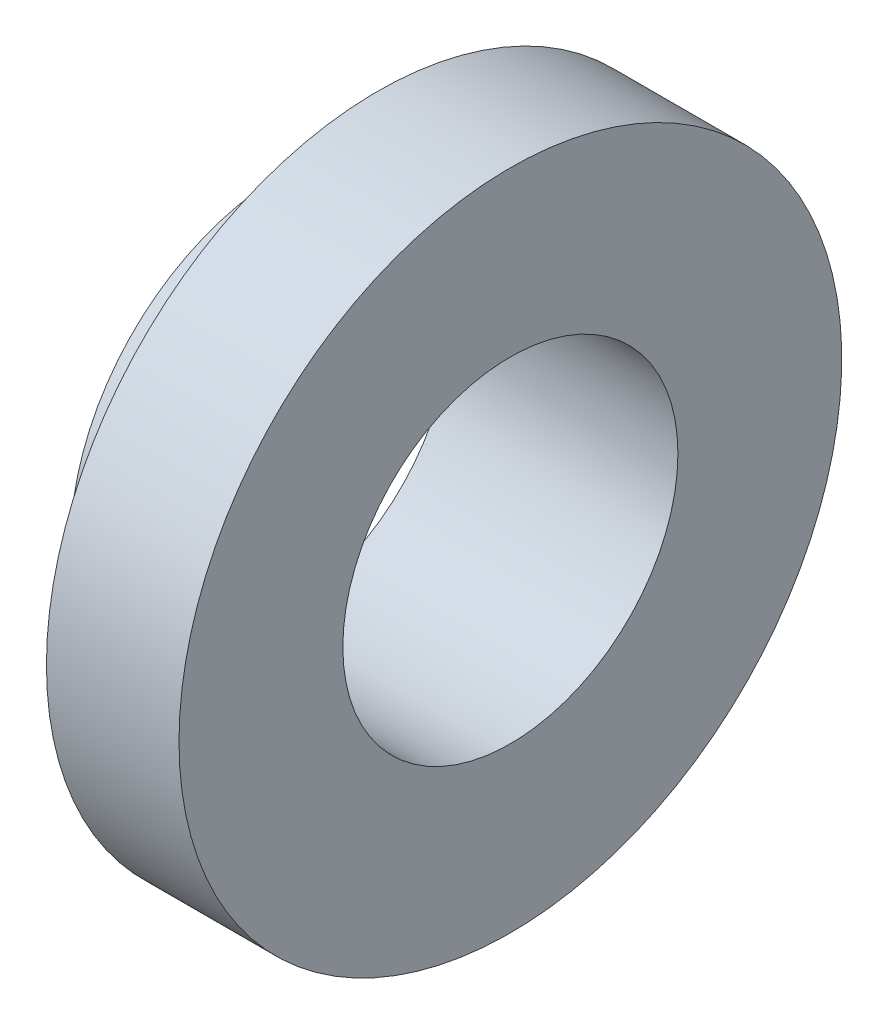
ISO-10303-21;
HEADER;
FILE_DESCRIPTION(('STEP AP214'),'2;1');
FILE_NAME('part.step','',(''),(''),'','','');
FILE_SCHEMA(('AUTOMOTIVE_DESIGN { 1 0 10303 214 1 1 1 1 }'));
ENDSEC;
DATA;
#1=APPLICATION_CONTEXT('core data for automotive mechanical design processes');
#2=APPLICATION_PROTOCOL_DEFINITION('international standard','automotive_design',2000,#1);
#3=PRODUCT_CONTEXT('',#1,'mechanical');
#4=PRODUCT('Part','Part','',(#3));
#5=PRODUCT_RELATED_PRODUCT_CATEGORY('part','',(#4));
#6=PRODUCT_DEFINITION_FORMATION('','',#4);
#7=PRODUCT_DEFINITION_CONTEXT('part definition',#1,'design');
#8=PRODUCT_DEFINITION('design','',#6,#7);
#9=PRODUCT_DEFINITION_SHAPE('','',#8);
#10=(LENGTH_UNIT() NAMED_UNIT(*) SI_UNIT(.MILLI.,.METRE.));
#11=(NAMED_UNIT(*) PLANE_ANGLE_UNIT() SI_UNIT($,.RADIAN.));
#12=(NAMED_UNIT(*) SI_UNIT($,.STERADIAN.) SOLID_ANGLE_UNIT());
#13=UNCERTAINTY_MEASURE_WITH_UNIT(LENGTH_MEASURE(1.E-05),#10,'distance_accuracy_value','');
#14=(GEOMETRIC_REPRESENTATION_CONTEXT(3) GLOBAL_UNCERTAINTY_ASSIGNED_CONTEXT((#13)) GLOBAL_UNIT_ASSIGNED_CONTEXT((#10,
#11,#12)) REPRESENTATION_CONTEXT('',''));
#15=CARTESIAN_POINT('',(0.,0.,0.));
#16=DIRECTION('',(0.,0.,1.));
#17=DIRECTION('',(1.,0.,0.));
#18=AXIS2_PLACEMENT_3D('',#15,#16,#17);
#19=CARTESIAN_POINT('',(5.45020000002849,4.0132,0.));
#20=DIRECTION('',(-1.,0.,0.));
#21=DIRECTION('',(0.,0.,1.));
#22=AXIS2_PLACEMENT_3D('',#19,#20,#21);
#23=PLANE('',#22);
#24=CARTESIAN_POINT('',(5.45020000002849,0.,0.));
#25=DIRECTION('',(-1.,0.,0.));
#26=DIRECTION('',(0.,0.,1.));
#27=AXIS2_PLACEMENT_3D('',#24,#25,#26);
#28=CIRCLE('',#27,7.9375);
#29=CARTESIAN_POINT('',(5.45020000002849,0.,7.9375));
#30=VERTEX_POINT('',#29);
#31=EDGE_CURVE('E62',#30,#30,#28,.T.);
#32=ORIENTED_EDGE('',*,*,#31,.F.);
#33=EDGE_LOOP('',(#32));
#34=FACE_BOUND('',#33,.T.);
#35=CARTESIAN_POINT('',(5.45020000002849,0.,0.));
#36=DIRECTION('',(-1.,0.,0.));
#37=DIRECTION('',(0.,0.,1.));
#38=AXIS2_PLACEMENT_3D('',#35,#36,#37);
#39=CIRCLE('',#38,4.0132);
#40=CARTESIAN_POINT('',(5.45020000002849,0.,4.0132));
#41=VERTEX_POINT('',#40);
#42=EDGE_CURVE('E10',#41,#41,#39,.T.);
#43=ORIENTED_EDGE('',*,*,#42,.T.);
#44=EDGE_LOOP('',(#43));
#45=FACE_BOUND('',#44,.T.);
#46=ADVANCED_FACE('F35',(#34,#45),#23,.F.);
#47=CARTESIAN_POINT('',(0.,0.,0.));
#48=DIRECTION('',(-1.,0.,0.));
#49=DIRECTION('',(0.,0.,1.));
#50=AXIS2_PLACEMENT_3D('',#47,#48,#49);
#51=CYLINDRICAL_SURFACE('',#50,4.0132);
#52=ORIENTED_EDGE('',*,*,#42,.F.);
#53=EDGE_LOOP('',(#52));
#54=FACE_BOUND('',#53,.T.);
#55=CARTESIAN_POINT('',(0.,0.,0.));
#56=DIRECTION('',(-1.,0.,0.));
#57=DIRECTION('',(0.,0.,1.));
#58=AXIS2_PLACEMENT_3D('',#55,#56,#57);
#59=CIRCLE('',#58,4.0132);
#60=CARTESIAN_POINT('',(0.,0.,4.0132));
#61=VERTEX_POINT('',#60);
#62=EDGE_CURVE('E42',#61,#61,#59,.T.);
#63=ORIENTED_EDGE('',*,*,#62,.T.);
#64=EDGE_LOOP('',(#63));
#65=FACE_BOUND('',#64,.T.);
#66=ADVANCED_FACE('F70',(#54,#65),#51,.F.);
#67=CARTESIAN_POINT('',(0.,4.0132,0.));
#68=DIRECTION('',(1.,0.,0.));
#69=DIRECTION('',(0.,0.,-1.));
#70=AXIS2_PLACEMENT_3D('',#67,#68,#69);
#71=PLANE('',#70);
#72=ORIENTED_EDGE('',*,*,#62,.F.);
#73=EDGE_LOOP('',(#72));
#74=FACE_BOUND('',#73,.T.);
#75=CARTESIAN_POINT('',(0.,0.,0.));
#76=DIRECTION('',(-1.,0.,0.));
#77=DIRECTION('',(0.,0.,1.));
#78=AXIS2_PLACEMENT_3D('',#75,#76,#77);
#79=CIRCLE('',#78,5.08);
#80=CARTESIAN_POINT('',(0.,0.,5.08));
#81=VERTEX_POINT('',#80);
#82=EDGE_CURVE('E47',#81,#81,#79,.T.);
#83=ORIENTED_EDGE('',*,*,#82,.T.);
#84=EDGE_LOOP('',(#83));
#85=FACE_BOUND('',#84,.T.);
#86=ADVANCED_FACE('F74',(#74,#85),#71,.F.);
#87=CARTESIAN_POINT('',(0.,0.,0.));
#88=DIRECTION('',(-1.,0.,0.));
#89=DIRECTION('',(0.,0.,1.));
#90=AXIS2_PLACEMENT_3D('',#87,#88,#89);
#91=CYLINDRICAL_SURFACE('',#90,5.08);
#92=ORIENTED_EDGE('',*,*,#82,.F.);
#93=EDGE_LOOP('',(#92));
#94=FACE_BOUND('',#93,.T.);
#95=CARTESIAN_POINT('',(2.27520000002849,0.,0.));
#96=DIRECTION('',(-1.,0.,0.));
#97=DIRECTION('',(0.,0.,1.));
#98=AXIS2_PLACEMENT_3D('',#95,#96,#97);
#99=CIRCLE('',#98,5.08);
#100=CARTESIAN_POINT('',(2.27520000002849,0.,5.08));
#101=VERTEX_POINT('',#100);
#102=EDGE_CURVE('E53',#101,#101,#99,.T.);
#103=ORIENTED_EDGE('',*,*,#102,.T.);
#104=EDGE_LOOP('',(#103));
#105=FACE_BOUND('',#104,.T.);
#106=ADVANCED_FACE('F79',(#94,#105),#91,.T.);
#107=CARTESIAN_POINT('',(2.27520000002849,7.9375,0.));
#108=DIRECTION('',(1.,0.,0.));
#109=DIRECTION('',(0.,0.,-1.));
#110=AXIS2_PLACEMENT_3D('',#107,#108,#109);
#111=PLANE('',#110);
#112=ORIENTED_EDGE('',*,*,#102,.F.);
#113=EDGE_LOOP('',(#112));
#114=FACE_BOUND('',#113,.T.);
#115=CARTESIAN_POINT('',(2.27520000002849,0.,0.));
#116=DIRECTION('',(-1.,0.,0.));
#117=DIRECTION('',(0.,0.,1.));
#118=AXIS2_PLACEMENT_3D('',#115,#116,#117);
#119=CIRCLE('',#118,7.9375);
#120=CARTESIAN_POINT('',(2.27520000002849,0.,7.9375));
#121=VERTEX_POINT('',#120);
#122=EDGE_CURVE('E58',#121,#121,#119,.T.);
#123=ORIENTED_EDGE('',*,*,#122,.T.);
#124=EDGE_LOOP('',(#123));
#125=FACE_BOUND('',#124,.T.);
#126=ADVANCED_FACE('F85',(#114,#125),#111,.F.);
#127=CARTESIAN_POINT('',(0.,0.,0.));
#128=DIRECTION('',(-1.,0.,0.));
#129=DIRECTION('',(0.,0.,1.));
#130=AXIS2_PLACEMENT_3D('',#127,#128,#129);
#131=CYLINDRICAL_SURFACE('',#130,7.9375);
#132=ORIENTED_EDGE('',*,*,#122,.F.);
#133=EDGE_LOOP('',(#132));
#134=FACE_BOUND('',#133,.T.);
#135=ORIENTED_EDGE('',*,*,#31,.T.);
#136=EDGE_LOOP('',(#135));
#137=FACE_BOUND('',#136,.T.);
#138=ADVANCED_FACE('F67',(#134,#137),#131,.T.);
#139=CLOSED_SHELL('',(#46,#66,#86,#106,#126,#138));
#140=MANIFOLD_SOLID_BREP('B2',#139);
#141=ADVANCED_BREP_SHAPE_REPRESENTATION('',(#18,#140),#14);
#142=SHAPE_DEFINITION_REPRESENTATION(#9,#141);
ENDSEC;
END-ISO-10303-21;
